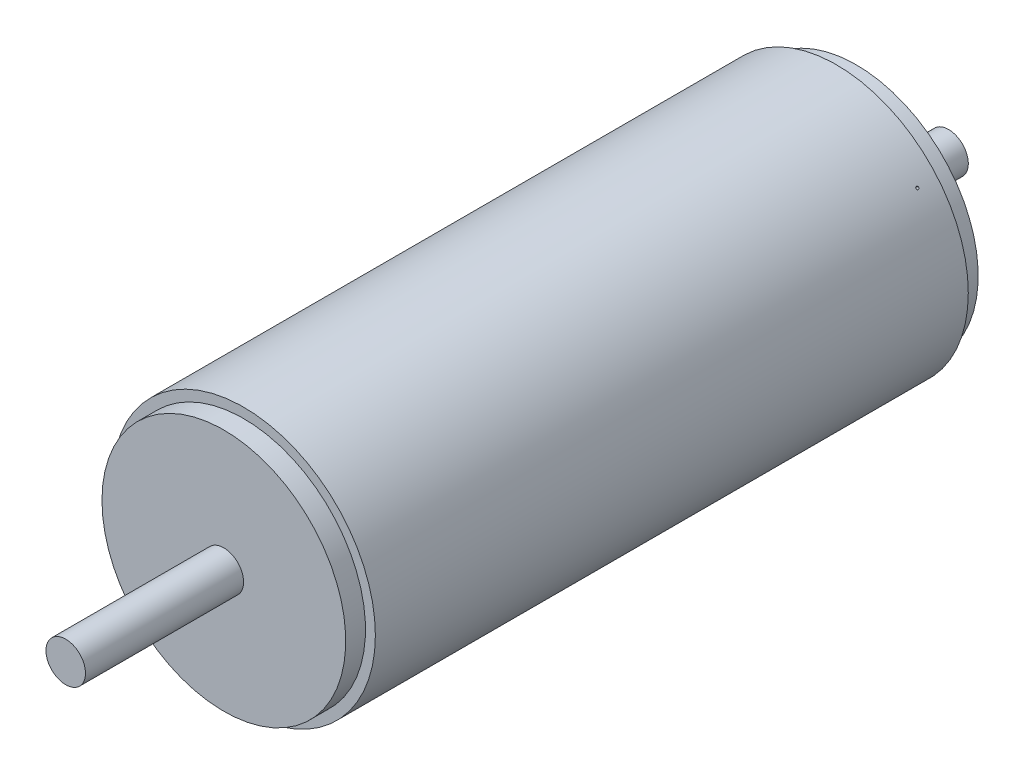
ISO-10303-21;
HEADER;
FILE_DESCRIPTION(('STEP AP214'),'2;1');
FILE_NAME('part.step','',(''),(''),'','','');
FILE_SCHEMA(('AUTOMOTIVE_DESIGN { 1 0 10303 214 1 1 1 1 }'));
ENDSEC;
DATA;
#1=APPLICATION_CONTEXT('core data for automotive mechanical design processes');
#2=APPLICATION_PROTOCOL_DEFINITION('international standard','automotive_design',2000,#1);
#3=PRODUCT_CONTEXT('',#1,'mechanical');
#4=PRODUCT('Part','Part','',(#3));
#5=PRODUCT_RELATED_PRODUCT_CATEGORY('part','',(#4));
#6=PRODUCT_DEFINITION_FORMATION('','',#4);
#7=PRODUCT_DEFINITION_CONTEXT('part definition',#1,'design');
#8=PRODUCT_DEFINITION('design','',#6,#7);
#9=PRODUCT_DEFINITION_SHAPE('','',#8);
#10=(LENGTH_UNIT() NAMED_UNIT(*) SI_UNIT(.MILLI.,.METRE.));
#11=(NAMED_UNIT(*) PLANE_ANGLE_UNIT() SI_UNIT($,.RADIAN.));
#12=(NAMED_UNIT(*) SI_UNIT($,.STERADIAN.) SOLID_ANGLE_UNIT());
#13=UNCERTAINTY_MEASURE_WITH_UNIT(LENGTH_MEASURE(1.E-05),#10,'distance_accuracy_value','');
#14=(GEOMETRIC_REPRESENTATION_CONTEXT(3) GLOBAL_UNCERTAINTY_ASSIGNED_CONTEXT((#13)) GLOBAL_UNIT_ASSIGNED_CONTEXT((#10,
#11,#12)) REPRESENTATION_CONTEXT('',''));
#15=CARTESIAN_POINT('',(0.,0.,0.));
#16=DIRECTION('',(0.,0.,1.));
#17=DIRECTION('',(1.,0.,0.));
#18=AXIS2_PLACEMENT_3D('',#15,#16,#17);
#19=CARTESIAN_POINT('',(0.,0.,450.));
#20=DIRECTION('',(0.,0.,-1.));
#21=DIRECTION('',(-1.,0.,0.));
#22=AXIS2_PLACEMENT_3D('',#19,#20,#21);
#23=CYLINDRICAL_SURFACE('',#22,100.);
#24=CARTESIAN_POINT('',(76.2971872125407,64.6431684206035,16.));
#25=CARTESIAN_POINT('',(76.28651278779,64.6557672773324,16.0000012742307));
#26=CARTESIAN_POINT('',(76.2758346655152,64.6683641272746,15.9996066258395));
#27=CARTESIAN_POINT('',(76.2545746611717,64.6934317425207,15.9980176407513));
#28=CARTESIAN_POINT('',(76.2439926416931,64.7059027607206,15.9968291096176));
#29=CARTESIAN_POINT('',(76.2229248868864,64.7307190251472,15.9936526647475));
#30=CARTESIAN_POINT('',(76.212438933746,64.7430645881794,15.9916686860314));
#31=CARTESIAN_POINT('',(76.1915636373311,64.7676299521439,15.9869036774601));
#32=CARTESIAN_POINT('',(76.1811741196704,64.7798499880043,15.9841246236324));
#33=CARTESIAN_POINT('',(76.1604917801446,64.8041645773315,15.9777713473612));
#34=CARTESIAN_POINT('',(76.150198958384,64.8162591306625,15.9741971240576));
#35=CARTESIAN_POINT('',(76.1297099965847,64.8403231498682,15.9662555311131));
#36=CARTESIAN_POINT('',(76.1195141584845,64.8522922325642,15.9618862224238));
#37=CARTESIAN_POINT('',(76.0992189929151,64.8761058836113,15.952356366486));
#38=CARTESIAN_POINT('',(76.0891203857399,64.8879495512763,15.9471920372154));
#39=CARTESIAN_POINT('',(76.0690194755798,64.9115129821113,15.9360740135882));
#40=CARTESIAN_POINT('',(76.0590184110193,64.9232312129797,15.9301148401363));
#41=CARTESIAN_POINT('',(76.0392161218227,64.9464228713864,15.9174750360784));
#42=CARTESIAN_POINT('',(76.0294147171729,64.9578965199176,15.9107950929609));
#43=CARTESIAN_POINT('',(76.0101002176426,64.9804961836911,15.8967570423766));
#44=CARTESIAN_POINT('',(76.000585552003,64.9916241108596,15.8894041799686));
#45=CARTESIAN_POINT('',(75.9818447689133,65.0135329935904,15.8740221077121));
#46=CARTESIAN_POINT('',(75.9726174703068,65.0243153769152,15.8659963721187));
#47=CARTESIAN_POINT('',(75.9544514195047,65.0455340831021,15.8492703471499));
#48=CARTESIAN_POINT('',(75.9455120133924,65.0559711919409,15.8405717655471));
#49=CARTESIAN_POINT('',(75.9279216176491,65.0765003788304,15.8225018333079));
#50=CARTESIAN_POINT('',(75.9192706282002,65.0865924566632,15.8131304822466));
#51=CARTESIAN_POINT('',(75.9022567964594,65.1064327422485,15.7937167222268));
#52=CARTESIAN_POINT('',(75.8938947176921,65.1161800402346,15.7836727147754));
#53=CARTESIAN_POINT('',(75.8774583068777,65.1353320473236,15.7629151965191));
#54=CARTESIAN_POINT('',(75.8693855867615,65.1447348422883,15.7521986444535));
#55=CARTESIAN_POINT('',(75.853527458041,65.1631991341498,15.7300975281535));
#56=CARTESIAN_POINT('',(75.8457445666186,65.1722576507653,15.7187086716437));
#57=CARTESIAN_POINT('',(75.8305420612433,65.1899457472396,15.6953814803623));
#58=CARTESIAN_POINT('',(75.8231222546635,65.1985755545788,15.6834434436143));
#59=CARTESIAN_POINT('',(75.8087205959998,65.2153203067041,15.6591139942333));
#60=CARTESIAN_POINT('',(75.8017359700516,65.2234385173067,15.6467264746665));
#61=CARTESIAN_POINT('',(75.7882045118332,65.2391612755118,15.6214995979331));
#62=CARTESIAN_POINT('',(75.7816557110494,65.2467681345969,15.6086627382801));
#63=CARTESIAN_POINT('',(75.7689955056873,65.26146959691,15.5825385701974));
#64=CARTESIAN_POINT('',(75.7628830647845,65.2685654142076,15.5692524475055));
#65=CARTESIAN_POINT('',(75.7510950468294,65.2822462906354,15.5422310672246));
#66=CARTESIAN_POINT('',(75.7454194688335,65.288831350869,15.5284958106059));
#67=CARTESIAN_POINT('',(75.7345045178039,65.3014922914402,15.5005773356868));
#68=CARTESIAN_POINT('',(75.729266252956,65.3075668784408,15.4863930978858));
#69=CARTESIAN_POINT('',(75.7192251603829,65.3192085109307,15.4575776249543));
#70=CARTESIAN_POINT('',(75.7144245898251,65.3247729262317,15.4429445415215));
#71=CARTESIAN_POINT('',(75.7052581170602,65.3353957899811,15.4132322617071));
#72=CARTESIAN_POINT('',(75.7008956256851,65.3404502693649,15.3981505968417));
#73=CARTESIAN_POINT('',(75.6926288456937,65.350026614508,15.3676319861981));
#74=CARTESIAN_POINT('',(75.6887262565296,65.3545465050407,15.3521939602034));
#75=CARTESIAN_POINT('',(75.6814456835964,65.3629773653948,15.3211568346413));
#76=CARTESIAN_POINT('',(75.6780640936576,65.3668925214989,15.3055597208298));
#77=CARTESIAN_POINT('',(75.6718248160568,65.3741153031987,15.2742054452487));
#78=CARTESIAN_POINT('',(75.6689646372895,65.3774258176939,15.2584494455029));
#79=CARTESIAN_POINT('',(75.6637672509051,65.3834408789437,15.2267781914475));
#80=CARTESIAN_POINT('',(75.6614287652331,65.386146906605,15.2108634283781));
#81=CARTESIAN_POINT('',(75.6572737207949,65.3909545979969,15.1788753022619));
#82=CARTESIAN_POINT('',(75.6554571611328,65.393056262765,15.1628019394875));
#83=CARTESIAN_POINT('',(75.6523448222472,65.3966568608532,15.1304970814101));
#84=CARTESIAN_POINT('',(75.6510503458043,65.3981542863891,15.1142652927853));
#85=CARTESIAN_POINT('',(75.648980978072,65.4005480060806,15.0816438118861));
#86=CARTESIAN_POINT('',(75.648208680561,65.4014412993826,15.0652537356618));
#87=CARTESIAN_POINT('',(75.6471824330783,65.4026283153313,15.032315837489));
#88=CARTESIAN_POINT('',(75.6469323171308,65.4029176031777,15.0157677388039));
#89=CARTESIAN_POINT('',(75.6469492088197,65.402898065743,14.9827097902789));
#90=CARTESIAN_POINT('',(75.6472150421424,65.4025905986913,14.9661999390089));
#91=CARTESIAN_POINT('',(75.6482702469059,65.4013700873344,14.9333387173403));
#92=CARTESIAN_POINT('',(75.6490558185911,65.4004614382105,14.9169870642462));
#93=CARTESIAN_POINT('',(75.6511492360255,65.398039892772,14.884442613108));
#94=CARTESIAN_POINT('',(75.6524545117063,65.3965299699036,14.8682494292601));
#95=CARTESIAN_POINT('',(75.655585969405,65.3929072403179,14.8360219583853));
#96=CARTESIAN_POINT('',(75.6574108606687,65.3907959274822,14.8199873782528));
#97=CARTESIAN_POINT('',(75.6615800982207,65.3859717921076,14.7880769936376));
#98=CARTESIAN_POINT('',(75.663924445403,65.3832589685334,14.7722011894283));
#99=CARTESIAN_POINT('',(75.6691310989808,65.3772331519863,14.7406080307885));
#100=CARTESIAN_POINT('',(75.6719946715514,65.3739186918497,14.724891165109));
#101=CARTESIAN_POINT('',(75.6782382894145,65.3666908472749,14.693615334627));
#102=CARTESIAN_POINT('',(75.6816208027072,65.3627746006847,14.6780575247599));
#103=CARTESIAN_POINT('',(75.6889008024634,65.3543443584622,14.6470992028982));
#104=CARTESIAN_POINT('',(75.6928018620189,65.349826214876,14.6317006633373));
#105=CARTESIAN_POINT('',(75.7010743527055,65.3402432038852,14.6012193901508));
#106=CARTESIAN_POINT('',(75.7054453528243,65.3351788374427,14.5861363820479));
#107=CARTESIAN_POINT('',(75.7146289490393,65.3245360651283,14.5564222775941));
#108=CARTESIAN_POINT('',(75.7194381302741,65.3189616330888,14.5417887053035));
#109=CARTESIAN_POINT('',(75.7294965654344,65.3072998135915,14.512973120475));
#110=CARTESIAN_POINT('',(75.7347435595325,65.3012150594808,14.4987892542452));
#111=CARTESIAN_POINT('',(75.7456760834043,65.2885336377285,14.4708723844977));
#112=CARTESIAN_POINT('',(75.7513605037536,65.2819382649028,14.4571383586171));
#113=CARTESIAN_POINT('',(75.7631663199206,65.2682366158614,14.4301202997773));
#114=CARTESIAN_POINT('',(75.7692877166809,65.2611303385437,14.4168362677887));
#115=CARTESIAN_POINT('',(75.7819659446928,65.2464078102792,14.3907171374404));
#116=CARTESIAN_POINT('',(75.7885238132797,65.2387903440387,14.3778832279222));
#117=CARTESIAN_POINT('',(75.8020735174066,65.2230462248531,14.3526631068611));
#118=CARTESIAN_POINT('',(75.8090673232109,65.2149172582831,14.3402793991672));
#119=CARTESIAN_POINT('',(75.8234874465899,65.1981508521987,14.3159584174449));
#120=CARTESIAN_POINT('',(75.8309165401827,65.1895101441913,14.3040250459671));
#121=CARTESIAN_POINT('',(75.8461300384852,65.1718090466351,14.2807196776767));
#122=CARTESIAN_POINT('',(75.8539142792872,65.1627488506606,14.2693474268401));
#123=CARTESIAN_POINT('',(75.8697744377372,65.1442819731132,14.2472790440035));
#124=CARTESIAN_POINT('',(75.8778478463979,65.1348782622712,14.2365786266635));
#125=CARTESIAN_POINT('',(75.8942849635432,65.1157252001523,14.2158528951169));
#126=CARTESIAN_POINT('',(75.9026470654999,65.1059777567019,14.2058245449405));
#127=CARTESIAN_POINT('',(75.919660278066,65.0861379526488,14.1864416201346));
#128=CARTESIAN_POINT('',(75.9283106277648,65.0760464987509,14.1770854499429));
#129=CARTESIAN_POINT('',(75.9458990818507,65.0555193301429,14.1590454023794));
#130=CARTESIAN_POINT('',(75.954837186055,65.0450836156516,14.15036152458));
#131=CARTESIAN_POINT('',(75.9729999745147,65.0238684663596,14.133664432642));
#132=CARTESIAN_POINT('',(75.9822253103486,65.0130882483386,14.1256529228909));
#133=CARTESIAN_POINT('',(76.0009615129815,64.9911844623291,14.1102988337492));
#134=CARTESIAN_POINT('',(76.0104735566262,64.9800594716795,14.102959721579));
#135=CARTESIAN_POINT('',(76.0297821591878,64.9574664470524,14.0889486969223));
#136=CARTESIAN_POINT('',(76.0395802829917,64.9459965081298,14.0822820186379));
#137=CARTESIAN_POINT('',(76.0593660222,64.9228239718085,14.0696741708395));
#138=CARTESIAN_POINT('',(76.0693536353078,64.9111213772293,14.0637329925392));
#139=CARTESIAN_POINT('',(76.0894271765754,64.8875897945476,14.0526485321405));
#140=CARTESIAN_POINT('',(76.0995118757525,64.8757623272287,14.0474998033125));
#141=CARTESIAN_POINT('',(76.1197787617188,64.8519816515784,14.0379987210846));
#142=CARTESIAN_POINT('',(76.1299602337801,64.8400293370835,14.0336426084536));
#143=CARTESIAN_POINT('',(76.1504200056084,64.8159994242078,14.0257249929393));
#144=CARTESIAN_POINT('',(76.1606980057856,64.8039222060796,14.022161562838));
#145=CARTESIAN_POINT('',(76.1813502482594,64.7796428543177,14.0158274688605));
#146=CARTESIAN_POINT('',(76.1917244904523,64.7674407208188,14.013056804129));
#147=CARTESIAN_POINT('',(76.2125687851986,64.7429117269728,14.0083061824807));
#148=CARTESIAN_POINT('',(76.2230390107726,64.7305846334841,14.0063281894112));
#149=CARTESIAN_POINT('',(76.2440748625827,64.7058058721759,14.0031613344766));
#150=CARTESIAN_POINT('',(76.254640704922,64.6933538899317,14.0019763834341));
#151=CARTESIAN_POINT('',(76.2758679059664,64.6683249138343,14.0003921977062));
#152=CARTESIAN_POINT('',(76.2865294009746,64.6557476689475,13.9999987331797));
#153=CARTESIAN_POINT('',(76.2971872125407,64.6431684206035,14.));
#154=B_SPLINE_CURVE_WITH_KNOTS('',3,(#24,#25,#26,#27,#28,#29,#30,#31,#32,#33,#34,#35,#36,#37,
#38,#39,#40,#41,#42,#43,#44,#45,#46,#47,#48,#49,#50,#51,#52,#53,#54,#55,#56,#57,#58,#59,#60,#61,
#62,#63,#64,#65,#66,#67,#68,#69,#70,#71,#72,#73,#74,#75,#76,#77,#78,#79,#80,#81,#82,#83,#84,#85,
#86,#87,#88,#89,#90,#91,#92,#93,#94,#95,#96,#97,#98,#99,#100,#101,#102,#103,#104,#105,#106,#107,
#108,#109,#110,#111,#112,#113,#114,#115,#116,#117,#118,#119,#120,#121,#122,#123,#124,#125,#126,
#127,#128,#129,#130,#131,#132,#133,#134,#135,#136,#137,#138,#139,#140,#141,#142,#143,#144,#145,
#146,#147,#148,#149,#150,#151,#152,#153),.UNSPECIFIED.,.F.,.F.,(4,2,2,2,2,2,2,2,2,2,2,2,2,2,2,2,
2,2,2,2,2,2,2,2,2,2,2,2,2,2,2,2,2,2,2,2,2,2,2,2,2,2,2,2,2,2,2,2,2,2,2,2,2,2,2,2,2,2,2,2,2,2,2,2,
4),(0.,0.0495350659108407,0.0987117972596807,0.147648198765146,0.196464018058296,
0.245279890159645,0.294216449699193,0.343393443150698,0.392928873350538,0.442417466228152,
0.491548719692359,0.540440306186351,0.589211632945267,0.63798299051058,0.68687466919654,
0.736006075565222,0.785494880964588,0.834957139978003,0.884062488458616,0.932928413354765,
0.981674132822426,1.03041974699294,1.07928535677439,1.12839018262495,1.17785171523767,
1.22749064096813,1.27676884537788,1.32580506681382,1.37471980586324,1.42363446093279,
1.4726704310532,1.5219482186607,1.57158656510924,1.62111206589082,1.67027943352629,
1.71920661733316,1.76801330799025,1.81682008265329,1.86574751785708,1.91491530243892,
1.96444138272155,2.01392242086257,2.06304633480116,2.11193075151298,2.16069503111674,
2.20945941591407,2.25834414743023,2.30746858348214,2.35695034730156,2.40640950081629,
2.45551188968942,2.50437497804632,2.55311796009058,2.6018609111441,2.65072390675706,
2.69982614180948,2.74928508152714,2.79874342219711,2.84784497761957,2.89670721141225,
2.94544931744706,2.99419137088586,3.04305344727799,3.09215474164475,3.14161271947267),.UNSPECIFIED.);
#155=CARTESIAN_POINT('',(76.2971872125408,64.6431684206035,16.));
#156=VERTEX_POINT('',#155);
#157=CARTESIAN_POINT('',(76.2971872125408,64.6431684206035,14.));
#158=VERTEX_POINT('',#157);
#159=EDGE_CURVE('E55',#156,#158,#154,.T.);
#160=ORIENTED_EDGE('',*,*,#159,.T.);
#161=CARTESIAN_POINT('',(76.2971872125407,64.6431684206035,14.));
#162=CARTESIAN_POINT('',(76.3078527907907,64.6305800495311,13.9999987297251));
#163=CARTESIAN_POINT('',(76.3185157851674,64.6179883679035,14.0003927459612));
#164=CARTESIAN_POINT('',(76.3397334706383,64.592920359562,14.0019791682777));
#165=CARTESIAN_POINT('',(76.350288387739,64.5804438565131,14.0031657877137));
#166=CARTESIAN_POINT('',(76.3712902331515,64.5556061974807,14.0063371117194));
#167=CARTESIAN_POINT('',(76.3817374370844,64.5432447757175,14.0083178941996));
#168=CARTESIAN_POINT('',(76.4025239192779,64.5186375977881,14.0130752204316));
#169=CARTESIAN_POINT('',(76.4128633998104,64.5063916318938,14.0158497946649));
#170=CARTESIAN_POINT('',(76.4334347243209,64.4820154043557,14.0221928278325));
#171=CARTESIAN_POINT('',(76.4436665681827,64.469885142837,14.0257612876245));
#172=CARTESIAN_POINT('',(76.4640230047203,64.4457402463233,14.0336900773957));
#173=CARTESIAN_POINT('',(76.4741472703517,64.4337259706093,14.038052340103));
#174=CARTESIAN_POINT('',(76.4942890873305,64.4098127819865,14.0475668300564));
#175=CARTESIAN_POINT('',(76.5043058716622,64.3979147239865,14.0527228271348));
#176=CARTESIAN_POINT('',(76.5242332850767,64.3742336760754,14.063822933586));
#177=CARTESIAN_POINT('',(76.5341426113005,64.3624521534947,14.069772504823));
#178=CARTESIAN_POINT('',(76.5537707856375,64.3391048369771,14.0824033821789));
#179=CARTESIAN_POINT('',(76.5634894632099,64.3275392365989,14.0890853111055));
#180=CARTESIAN_POINT('',(76.5826307485691,64.3047501159997,14.1031286973378));
#181=CARTESIAN_POINT('',(76.5920549896079,64.29352472633,14.1104848889208));
#182=CARTESIAN_POINT('',(76.6106080928987,64.2714161573842,14.1258749947747));
#183=CARTESIAN_POINT('',(76.6197381737006,64.2605315736927,14.1339054209201));
#184=CARTESIAN_POINT('',(76.6377038581877,64.2391044640936,14.1506421903457));
#185=CARTESIAN_POINT('',(76.6465401321647,64.2285611612869,14.1593468190331));
#186=CARTESIAN_POINT('',(76.66391920034,64.207816315098,14.1774302028365));
#187=CARTESIAN_POINT('',(76.6724619943526,64.197614771932,14.186808958379));
#188=CARTESIAN_POINT('',(76.68925520671,64.1775529870331,14.2062388778557));
#189=CARTESIAN_POINT('',(76.6975048501402,64.1676936512884,14.2162916465946));
#190=CARTESIAN_POINT('',(76.7137129645446,64.1483156718638,14.2370680307886));
#191=CARTESIAN_POINT('',(76.721669805942,64.1387989398904,14.2477946993416));
#192=CARTESIAN_POINT('',(76.7372935182656,64.1201055286416,14.2699173904441));
#193=CARTESIAN_POINT('',(76.7449578531157,64.1109318333208,14.2813177216812));
#194=CARTESIAN_POINT('',(76.7599279385515,64.0930074122703,14.3046775004887));
#195=CARTESIAN_POINT('',(76.767233615668,64.0842567732071,14.316637061643));
#196=CARTESIAN_POINT('',(76.781407437139,64.0672739661567,14.3410108510138));
#197=CARTESIAN_POINT('',(76.7882783663294,64.0590385030734,14.3534211604645));
#198=CARTESIAN_POINT('',(76.8015838525996,64.0430856931042,14.3786949040164));
#199=CARTESIAN_POINT('',(76.808020380114,64.0353660085221,14.3915558242222));
#200=CARTESIAN_POINT('',(76.8204583947561,64.0204441264335,14.417729389368));
#201=CARTESIAN_POINT('',(76.8264609165101,64.0132406986095,14.4310408409213));
#202=CARTESIAN_POINT('',(76.8380323175642,63.9993505536386,14.4581141467313));
#203=CARTESIAN_POINT('',(76.8436011978032,63.9926638353727,14.4718760000124));
#204=CARTESIAN_POINT('',(76.8543067758545,63.9798061904947,14.4998489277336));
#205=CARTESIAN_POINT('',(76.8594423721209,63.9736365787786,14.5140610278568));
#206=CARTESIAN_POINT('',(76.8692828741886,63.9618121215178,14.5429334817295));
#207=CARTESIAN_POINT('',(76.8739855404349,63.9561599534748,14.5575956944546));
#208=CARTESIAN_POINT('',(76.8829616473749,63.9453693238879,14.5873674749098));
#209=CARTESIAN_POINT('',(76.8872317096652,63.9402349069615,14.6024795243802));
#210=CARTESIAN_POINT('',(76.8953017643087,63.9305295324766,14.6329907095107));
#211=CARTESIAN_POINT('',(76.8991021862162,63.9259580600376,14.6483895677809));
#212=CARTESIAN_POINT('',(76.9061913671644,63.9174292345721,14.6793473321309));
#213=CARTESIAN_POINT('',(76.909483625579,63.9134676819738,14.6949042772027));
#214=CARTESIAN_POINT('',(76.9155577477579,63.9061577536051,14.7261771771373));
#215=CARTESIAN_POINT('',(76.9183420254439,63.9028064779531,14.7418919845137));
#216=CARTESIAN_POINT('',(76.9234015537941,63.896715948776,14.7734798324302));
#217=CARTESIAN_POINT('',(76.9256780415788,63.8939752078372,14.7893523877784));
#218=CARTESIAN_POINT('',(76.9297233875694,63.8891044665691,14.8212550836249));
#219=CARTESIAN_POINT('',(76.9314922466438,63.886974465195,14.8372852238535));
#220=CARTESIAN_POINT('',(76.9345237405675,63.8833238213131,14.8695026279773));
#221=CARTESIAN_POINT('',(76.9357851161882,63.8818046945852,14.8856901818762));
#222=CARTESIAN_POINT('',(76.9378030133802,63.8793743706223,14.918222187659));
#223=CARTESIAN_POINT('',(76.9385570288284,63.8784661911875,14.9345670196727));
#224=CARTESIAN_POINT('',(76.9395615163115,63.8772563147255,14.9674134217488));
#225=CARTESIAN_POINT('',(76.9398082843571,63.8769590788923,14.9839152668933));
#226=CARTESIAN_POINT('',(76.9397994907979,63.8769696707335,15.0169104191381));
#227=CARTESIAN_POINT('',(76.9395441789718,63.8772771975459,15.0334037264029));
#228=CARTESIAN_POINT('',(76.9385231794736,63.8785069612535,15.0662326187593));
#229=CARTESIAN_POINT('',(76.9377611884463,63.8794247458111,15.0825684830819));
#230=CARTESIAN_POINT('',(76.9357279194516,63.8818735794708,15.1150821199981));
#231=CARTESIAN_POINT('',(76.9344591424692,63.8834016169735,15.1312602750566));
#232=CARTESIAN_POINT('',(76.9314134206195,63.8870693863041,15.1634584502796));
#233=CARTESIAN_POINT('',(76.9296377323441,63.8892076055365,15.1794787613722));
#234=CARTESIAN_POINT('',(76.9255793001159,63.8940940887562,15.2113613688467));
#235=CARTESIAN_POINT('',(76.9232965552932,63.8968423537901,15.2272236649574));
#236=CARTESIAN_POINT('',(76.918225082297,63.9029472400543,15.2587905655852));
#237=CARTESIAN_POINT('',(76.9154351196681,63.9063053454785,15.2744946844959));
#238=CARTESIAN_POINT('',(76.9093501927508,63.9136282470122,15.3057457774429));
#239=CARTESIAN_POINT('',(76.906052819781,63.9175959366717,15.3212916036577));
#240=CARTESIAN_POINT('',(76.8989539775746,63.9261363464033,15.3522267058831));
#241=CARTESIAN_POINT('',(76.8951490166351,63.9307132567811,15.3676140211262));
#242=CARTESIAN_POINT('',(76.8870744571911,63.9404240004052,15.3980867111568));
#243=CARTESIAN_POINT('',(76.8828048937582,63.9455577916137,15.4131721086338));
#244=CARTESIAN_POINT('',(76.8738311778492,63.9563454934677,15.4428916858397));
#245=CARTESIAN_POINT('',(76.869130383132,63.9619953842754,15.4575283357883));
#246=CARTESIAN_POINT('',(76.8592950182609,63.9738136123064,15.4863507666794));
#247=CARTESIAN_POINT('',(76.8541626738311,63.9799792886054,15.5005383973426));
#248=CARTESIAN_POINT('',(76.8434649862482,63.9928273996286,15.5284634853045));
#249=CARTESIAN_POINT('',(76.8379007378174,63.9995085276215,15.5422019629155));
#250=CARTESIAN_POINT('',(76.8263399821641,64.0133858383429,15.5692296126005));
#251=CARTESIAN_POINT('',(76.8203434740076,64.0205820221843,15.5825187837036));
#252=CARTESIAN_POINT('',(76.8079188630305,64.0354877726626,15.6086488771208));
#253=CARTESIAN_POINT('',(76.8014897319419,64.0431985620411,15.6214886127015));
#254=CARTESIAN_POINT('',(76.7882004114435,64.0591319462731,15.6467210704371));
#255=CARTESIAN_POINT('',(76.7813382635735,64.0673568645934,15.6591112929514));
#256=CARTESIAN_POINT('',(76.7671833719948,64.0843169580189,15.6834459798784));
#257=CARTESIAN_POINT('',(76.7598878600794,64.0930554085229,15.6953865479012));
#258=CARTESIAN_POINT('',(76.7449349001477,64.1109593076761,15.7187165796056));
#259=CARTESIAN_POINT('',(76.7372773203412,64.1201249117886,15.7301058395143));
#260=CARTESIAN_POINT('',(76.7216676165706,64.1388015567358,15.7522076888402));
#261=CARTESIAN_POINT('',(76.7137180194014,64.1483096245393,15.7629245713897));
#262=CARTESIAN_POINT('',(76.6975248861088,64.1676697006812,15.7836826780013));
#263=CARTESIAN_POINT('',(76.6892829736399,64.1775198042577,15.793726943934));
#264=CARTESIAN_POINT('',(76.6725057143488,64.1975625537367,15.8131411483121));
#265=CARTESIAN_POINT('',(76.6639711396554,64.2077542969037,15.8225126855743));
#266=CARTESIAN_POINT('',(76.6466089989988,64.228478976847,15.8405829179548));
#267=CARTESIAN_POINT('',(76.6377814332206,64.2390119134076,15.8492816134981));
#268=CARTESIAN_POINT('',(76.6198336522741,64.2604177285462,15.8660077944881));
#269=CARTESIAN_POINT('',(76.6107127691084,64.2712913813754,15.8740335718158));
#270=CARTESIAN_POINT('',(76.5921785478497,64.2933775293686,15.8894156557146));
#271=CARTESIAN_POINT('',(76.5827639952176,64.3045914243584,15.896768487329));
#272=CARTESIAN_POINT('',(76.563642570545,64.3273570021713,15.9108064060618));
#273=CARTESIAN_POINT('',(76.5539340703316,64.3389105486963,15.9174862470823));
#274=CARTESIAN_POINT('',(76.5343099877368,64.3622531259867,15.9301249944071));
#275=CARTESIAN_POINT('',(76.5243942413217,64.3740423429349,15.9360833021649));
#276=CARTESIAN_POINT('',(76.5044537522778,64.3977390447784,15.9471997107016));
#277=CARTESIAN_POINT('',(76.494430317254,64.409645056924,15.9523632890196));
#278=CARTESIAN_POINT('',(76.4742749594552,64.4335744230828,15.9618917600104));
#279=CARTESIAN_POINT('',(76.4641438065416,64.4455969189646,15.9662604336061));
#280=CARTESIAN_POINT('',(76.4437733590082,64.4697585205443,15.9742008725463));
#281=CARTESIAN_POINT('',(76.4335343926484,64.4818972656016,15.9777745763691));
#282=CARTESIAN_POINT('',(76.4129485874075,64.5062907231732,15.9841269293976));
#283=CARTESIAN_POINT('',(76.4026017486432,64.5185454355622,15.9869055794632));
#284=CARTESIAN_POINT('',(76.3818003149295,64.5431703676859,15.9916698955984));
#285=CARTESIAN_POINT('',(76.3713455169602,64.5555407979465,15.9936535862276));
#286=CARTESIAN_POINT('',(76.350328248822,64.5803967337198,15.9968295695372));
#287=CARTESIAN_POINT('',(76.3397655020263,64.5928825060221,15.9980179283636));
#288=CARTESIAN_POINT('',(76.3185319210712,64.6179693134221,15.9996066824603));
#289=CARTESIAN_POINT('',(76.3078608601004,64.6305705255346,16.0000012738738));
#290=CARTESIAN_POINT('',(76.2971872125407,64.6431684206035,16.));
#291=B_SPLINE_CURVE_WITH_KNOTS('',3,(#161,#162,#163,#164,#165,#166,#167,#168,#169,#170,#171,
#172,#173,#174,#175,#176,#177,#178,#179,#180,#181,#182,#183,#184,#185,#186,#187,#188,#189,#190,
#191,#192,#193,#194,#195,#196,#197,#198,#199,#200,#201,#202,#203,#204,#205,#206,#207,#208,#209,
#210,#211,#212,#213,#214,#215,#216,#217,#218,#219,#220,#221,#222,#223,#224,#225,#226,#227,#228,
#229,#230,#231,#232,#233,#234,#235,#236,#237,#238,#239,#240,#241,#242,#243,#244,#245,#246,#247,
#248,#249,#250,#251,#252,#253,#254,#255,#256,#257,#258,#259,#260,#261,#262,#263,#264,#265,#266,
#267,#268,#269,#270,#271,#272,#273,#274,#275,#276,#277,#278,#279,#280,#281,#282,#283,#284,#285,
#286,#287,#288,#289,#290),.UNSPECIFIED.,.F.,.F.,(4,2,2,2,2,2,2,2,2,2,2,2,2,2,2,2,2,2,2,2,2,2,2,
2,2,2,2,2,2,2,2,2,2,2,2,2,2,2,2,2,2,2,2,2,2,2,2,2,2,2,2,2,2,2,2,2,2,2,2,2,2,2,2,2,4),(0.,
0.0494939154030072,0.0986303782419746,0.147527105188684,0.196303548675903,0.245080044857995,
0.293976929500394,0.343113653882889,0.392607932802137,0.442144633850677,0.491322964442287,
0.54026093373043,0.589078294020122,0.63789568520991,0.686833746970139,0.736012230929074,
0.785549145139895,0.835096164755997,0.88428445725387,0.933232102627516,0.982058926804497,
1.03088564524479,1.07983297419122,1.1290207418907,1.17856703211035,1.2280676642779,
1.27721054664657,1.32611344745789,1.37489587304144,1.42367821515091,1.47258086615672,
1.52172333421618,1.57122339054369,1.6206988274183,1.66981720347401,1.71869611774658,
1.76745490194257,1.81621376978971,1.86509293439849,1.91421172564552,1.96368773959027,
2.01316002129269,2.06227536628771,2.11115134037539,2.15990724098177,2.2086632469368,
2.25753953629283,2.30665540417171,2.35612841262538,2.40561956965399,2.45475327728557,
2.50364722331236,2.55242083114842,2.60119440816947,2.65008826197853,2.6992218166632,
2.74871276111112,2.79824448344318,2.84741784857537,2.89635083337231,2.94516315768995,
2.99397542920964,3.0429082560029,3.09208135908288,3.14161271719553),.UNSPECIFIED.);
#292=EDGE_CURVE('E11',#158,#156,#291,.T.);
#293=ORIENTED_EDGE('',*,*,#292,.T.);
#294=EDGE_LOOP('',(#160,#293));
#295=FACE_BOUND('',#294,.T.);
#296=CARTESIAN_POINT('',(0.,0.,450.));
#297=DIRECTION('',(0.,0.,1.));
#298=DIRECTION('',(1.,0.,0.));
#299=AXIS2_PLACEMENT_3D('',#296,#297,#298);
#300=CIRCLE('',#299,100.);
#301=CARTESIAN_POINT('',(100.,0.,450.));
#302=VERTEX_POINT('',#301);
#303=EDGE_CURVE('E82',#302,#302,#300,.T.);
#304=ORIENTED_EDGE('',*,*,#303,.F.);
#305=EDGE_LOOP('',(#304));
#306=FACE_BOUND('',#305,.T.);
#307=CARTESIAN_POINT('',(0.,0.,0.));
#308=DIRECTION('',(0.,0.,1.));
#309=DIRECTION('',(1.,0.,0.));
#310=AXIS2_PLACEMENT_3D('',#307,#308,#309);
#311=CIRCLE('',#310,100.);
#312=CARTESIAN_POINT('',(100.,0.,0.));
#313=VERTEX_POINT('',#312);
#314=EDGE_CURVE('E79',#313,#313,#311,.T.);
#315=ORIENTED_EDGE('',*,*,#314,.T.);
#316=EDGE_LOOP('',(#315));
#317=FACE_BOUND('',#316,.T.);
#318=ADVANCED_FACE('F45',(#295,#306,#317),#23,.T.);
#319=CARTESIAN_POINT('',(0.,0.,450.));
#320=DIRECTION('',(0.,0.,1.));
#321=DIRECTION('',(1.,0.,0.));
#322=AXIS2_PLACEMENT_3D('',#319,#320,#321);
#323=PLANE('',#322);
#324=CARTESIAN_POINT('',(0.,0.,450.));
#325=DIRECTION('',(0.,0.,-1.));
#326=DIRECTION('',(-1.,0.,0.));
#327=AXIS2_PLACEMENT_3D('',#324,#325,#326);
#328=CIRCLE('',#327,92.5);
#329=CARTESIAN_POINT('',(-92.5,0.,450.));
#330=VERTEX_POINT('',#329);
#331=EDGE_CURVE('E98',#330,#330,#328,.T.);
#332=ORIENTED_EDGE('',*,*,#331,.T.);
#333=EDGE_LOOP('',(#332));
#334=FACE_BOUND('',#333,.T.);
#335=ORIENTED_EDGE('',*,*,#303,.T.);
#336=EDGE_LOOP('',(#335));
#337=FACE_BOUND('',#336,.T.);
#338=ADVANCED_FACE('F164',(#334,#337),#323,.T.);
#339=CARTESIAN_POINT('',(0.,0.,0.));
#340=DIRECTION('',(0.,0.,1.));
#341=DIRECTION('',(1.,0.,0.));
#342=AXIS2_PLACEMENT_3D('',#339,#340,#341);
#343=PLANE('',#342);
#344=CARTESIAN_POINT('',(0.,0.,0.));
#345=DIRECTION('',(0.,0.,-1.));
#346=DIRECTION('',(-1.,0.,0.));
#347=AXIS2_PLACEMENT_3D('',#344,#345,#346);
#348=CIRCLE('',#347,92.5);
#349=CARTESIAN_POINT('',(-92.5,0.,0.));
#350=VERTEX_POINT('',#349);
#351=EDGE_CURVE('E86',#350,#350,#348,.T.);
#352=ORIENTED_EDGE('',*,*,#351,.F.);
#353=EDGE_LOOP('',(#352));
#354=FACE_BOUND('',#353,.T.);
#355=ORIENTED_EDGE('',*,*,#314,.F.);
#356=EDGE_LOOP('',(#355));
#357=FACE_BOUND('',#356,.T.);
#358=ADVANCED_FACE('F162',(#354,#357),#343,.F.);
#359=CARTESIAN_POINT('',(0.,0.,-15.));
#360=DIRECTION('',(0.,0.,1.));
#361=DIRECTION('',(1.,0.,0.));
#362=AXIS2_PLACEMENT_3D('',#359,#360,#361);
#363=CYLINDRICAL_SURFACE('',#362,92.5);
#364=CARTESIAN_POINT('',(0.,0.,-15.));
#365=DIRECTION('',(0.,0.,-1.));
#366=DIRECTION('',(-1.,0.,0.));
#367=AXIS2_PLACEMENT_3D('',#364,#365,#366);
#368=CIRCLE('',#367,92.5);
#369=CARTESIAN_POINT('',(-92.5,0.,-15.));
#370=VERTEX_POINT('',#369);
#371=EDGE_CURVE('E83',#370,#370,#368,.T.);
#372=ORIENTED_EDGE('',*,*,#371,.F.);
#373=EDGE_LOOP('',(#372));
#374=FACE_BOUND('',#373,.T.);
#375=ORIENTED_EDGE('',*,*,#351,.T.);
#376=EDGE_LOOP('',(#375));
#377=FACE_BOUND('',#376,.T.);
#378=ADVANCED_FACE('F158',(#374,#377),#363,.T.);
#379=CARTESIAN_POINT('',(0.,0.,-15.));
#380=DIRECTION('',(0.,0.,-1.));
#381=DIRECTION('',(-1.,0.,0.));
#382=AXIS2_PLACEMENT_3D('',#379,#380,#381);
#383=PLANE('',#382);
#384=CARTESIAN_POINT('',(0.,0.,-15.));
#385=DIRECTION('',(0.,0.,-1.));
#386=DIRECTION('',(-1.,0.,0.));
#387=AXIS2_PLACEMENT_3D('',#384,#385,#386);
#388=CIRCLE('',#387,15.);
#389=CARTESIAN_POINT('',(-15.,0.,-15.));
#390=VERTEX_POINT('',#389);
#391=EDGE_CURVE('E89',#390,#390,#388,.T.);
#392=ORIENTED_EDGE('',*,*,#391,.F.);
#393=EDGE_LOOP('',(#392));
#394=FACE_BOUND('',#393,.T.);
#395=ORIENTED_EDGE('',*,*,#371,.T.);
#396=EDGE_LOOP('',(#395));
#397=FACE_BOUND('',#396,.T.);
#398=ADVANCED_FACE('F154',(#394,#397),#383,.T.);
#399=CARTESIAN_POINT('',(0.,0.,-85.));
#400=DIRECTION('',(0.,0.,1.));
#401=DIRECTION('',(1.,0.,0.));
#402=AXIS2_PLACEMENT_3D('',#399,#400,#401);
#403=CYLINDRICAL_SURFACE('',#402,15.);
#404=CARTESIAN_POINT('',(0.,0.,-85.));
#405=DIRECTION('',(0.,0.,-1.));
#406=DIRECTION('',(-1.,0.,0.));
#407=AXIS2_PLACEMENT_3D('',#404,#405,#406);
#408=CIRCLE('',#407,15.);
#409=CARTESIAN_POINT('',(-15.,0.,-85.));
#410=VERTEX_POINT('',#409);
#411=EDGE_CURVE('E92',#410,#410,#408,.T.);
#412=ORIENTED_EDGE('',*,*,#411,.F.);
#413=EDGE_LOOP('',(#412));
#414=FACE_BOUND('',#413,.T.);
#415=ORIENTED_EDGE('',*,*,#391,.T.);
#416=EDGE_LOOP('',(#415));
#417=FACE_BOUND('',#416,.T.);
#418=ADVANCED_FACE('F150',(#414,#417),#403,.T.);
#419=CARTESIAN_POINT('',(0.,0.,-85.));
#420=DIRECTION('',(0.,0.,-1.));
#421=DIRECTION('',(-1.,0.,0.));
#422=AXIS2_PLACEMENT_3D('',#419,#420,#421);
#423=PLANE('',#422);
#424=ORIENTED_EDGE('',*,*,#411,.T.);
#425=EDGE_LOOP('',(#424));
#426=FACE_BOUND('',#425,.T.);
#427=ADVANCED_FACE('F146',(#426),#423,.T.);
#428=CARTESIAN_POINT('',(0.,0.,465.));
#429=DIRECTION('',(0.,0.,-1.));
#430=DIRECTION('',(-1.,0.,0.));
#431=AXIS2_PLACEMENT_3D('',#428,#429,#430);
#432=CYLINDRICAL_SURFACE('',#431,92.5);
#433=CARTESIAN_POINT('',(0.,0.,465.));
#434=DIRECTION('',(0.,0.,-1.));
#435=DIRECTION('',(-1.,0.,0.));
#436=AXIS2_PLACEMENT_3D('',#433,#434,#435);
#437=CIRCLE('',#436,92.5);
#438=CARTESIAN_POINT('',(-92.5,0.,465.));
#439=VERTEX_POINT('',#438);
#440=EDGE_CURVE('E97',#439,#439,#437,.T.);
#441=ORIENTED_EDGE('',*,*,#440,.T.);
#442=EDGE_LOOP('',(#441));
#443=FACE_BOUND('',#442,.T.);
#444=ORIENTED_EDGE('',*,*,#331,.F.);
#445=EDGE_LOOP('',(#444));
#446=FACE_BOUND('',#445,.T.);
#447=ADVANCED_FACE('F142',(#443,#446),#432,.T.);
#448=CARTESIAN_POINT('',(0.,0.,465.));
#449=DIRECTION('',(0.,0.,1.));
#450=DIRECTION('',(-1.,0.,0.));
#451=AXIS2_PLACEMENT_3D('',#448,#449,#450);
#452=PLANE('',#451);
#453=CARTESIAN_POINT('',(0.,0.,465.));
#454=DIRECTION('',(0.,0.,1.));
#455=DIRECTION('',(1.,0.,0.));
#456=AXIS2_PLACEMENT_3D('',#453,#454,#455);
#457=CIRCLE('',#456,15.);
#458=CARTESIAN_POINT('',(15.,0.,465.));
#459=VERTEX_POINT('',#458);
#460=EDGE_CURVE('E66',#459,#459,#457,.T.);
#461=ORIENTED_EDGE('',*,*,#460,.F.);
#462=EDGE_LOOP('',(#461));
#463=FACE_BOUND('',#462,.T.);
#464=ORIENTED_EDGE('',*,*,#440,.F.);
#465=EDGE_LOOP('',(#464));
#466=FACE_BOUND('',#465,.T.);
#467=ADVANCED_FACE('F138',(#463,#466),#452,.T.);
#468=CARTESIAN_POINT('',(0.,0.,585.));
#469=DIRECTION('',(0.,0.,-1.));
#470=DIRECTION('',(-1.,0.,0.));
#471=AXIS2_PLACEMENT_3D('',#468,#469,#470);
#472=CYLINDRICAL_SURFACE('',#471,15.);
#473=CARTESIAN_POINT('',(0.,0.,585.));
#474=DIRECTION('',(0.,0.,1.));
#475=DIRECTION('',(1.,0.,0.));
#476=AXIS2_PLACEMENT_3D('',#473,#474,#475);
#477=CIRCLE('',#476,15.);
#478=CARTESIAN_POINT('',(15.,0.,585.));
#479=VERTEX_POINT('',#478);
#480=EDGE_CURVE('E101',#479,#479,#477,.T.);
#481=ORIENTED_EDGE('',*,*,#480,.F.);
#482=EDGE_LOOP('',(#481));
#483=FACE_BOUND('',#482,.T.);
#484=ORIENTED_EDGE('',*,*,#460,.T.);
#485=EDGE_LOOP('',(#484));
#486=FACE_BOUND('',#485,.T.);
#487=ADVANCED_FACE('F134',(#483,#486),#472,.T.);
#488=CARTESIAN_POINT('',(0.,0.,585.));
#489=DIRECTION('',(0.,0.,1.));
#490=DIRECTION('',(1.,0.,0.));
#491=AXIS2_PLACEMENT_3D('',#488,#489,#490);
#492=PLANE('',#491);
#493=ORIENTED_EDGE('',*,*,#480,.T.);
#494=EDGE_LOOP('',(#493));
#495=FACE_BOUND('',#494,.T.);
#496=ADVANCED_FACE('F122',(#495),#492,.T.);
#497=CARTESIAN_POINT('',(74.0082715961646,62.7038733679854,15.));
#498=DIRECTION('',(0.762971872125407,0.646431684206035,0.));
#499=DIRECTION('',(-0.646431684206035,0.762971872125408,0.));
#500=AXIS2_PLACEMENT_3D('',#497,#498,#499);
#501=CYLINDRICAL_SURFACE('',#500,1.);
#502=CARTESIAN_POINT('',(74.0082715961646,62.7038733679854,15.));
#503=DIRECTION('',(0.762971872125408,0.646431684206035,0.));
#504=DIRECTION('',(-0.646431684206035,0.762971872125408,0.));
#505=AXIS2_PLACEMENT_3D('',#502,#503,#504);
#506=CIRCLE('',#505,1.);
#507=CARTESIAN_POINT('',(73.3618399119585,63.4668452401108,15.));
#508=VERTEX_POINT('',#507);
#509=EDGE_CURVE('E108',#508,#508,#506,.T.);
#510=ORIENTED_EDGE('',*,*,#509,.F.);
#511=EDGE_LOOP('',(#510));
#512=FACE_BOUND('',#511,.T.);
#513=ORIENTED_EDGE('',*,*,#159,.F.);
#514=ORIENTED_EDGE('',*,*,#292,.F.);
#515=EDGE_LOOP('',(#513,#514));
#516=FACE_BOUND('',#515,.T.);
#517=ADVANCED_FACE('F63',(#512,#516),#501,.F.);
#518=CARTESIAN_POINT('',(74.0082715961646,62.7038733679854,15.));
#519=DIRECTION('',(0.762971872125408,0.646431684206035,0.));
#520=DIRECTION('',(-0.646431684206035,0.762971872125408,0.));
#521=AXIS2_PLACEMENT_3D('',#518,#519,#520);
#522=PLANE('',#521);
#523=ORIENTED_EDGE('',*,*,#509,.T.);
#524=EDGE_LOOP('',(#523));
#525=FACE_BOUND('',#524,.T.);
#526=ADVANCED_FACE('F121',(#525),#522,.T.);
#527=CLOSED_SHELL('',(#318,#338,#358,#378,#398,#418,#427,#447,#467,#487,#496,#517,#526));
#528=MANIFOLD_SOLID_BREP('B2',#527);
#529=ADVANCED_BREP_SHAPE_REPRESENTATION('',(#18,#528),#14);
#530=SHAPE_DEFINITION_REPRESENTATION(#9,#529);
ENDSEC;
END-ISO-10303-21;
